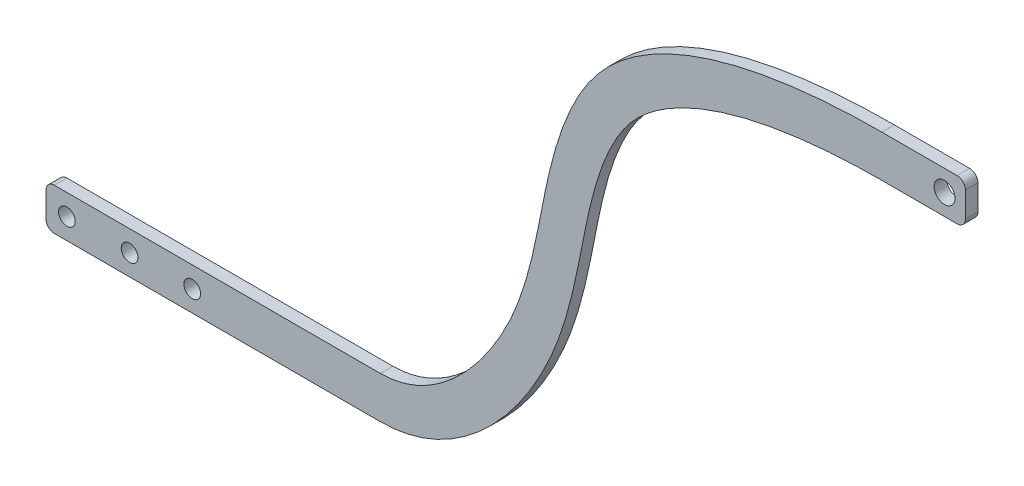
ISO-10303-21;
HEADER;
FILE_DESCRIPTION(('STEP AP214'),'2;1');
FILE_NAME('part.step','',(''),(''),'','','');
FILE_SCHEMA(('AUTOMOTIVE_DESIGN { 1 0 10303 214 1 1 1 1 }'));
ENDSEC;
DATA;
#1=APPLICATION_CONTEXT('core data for automotive mechanical design processes');
#2=APPLICATION_PROTOCOL_DEFINITION('international standard','automotive_design',2000,#1);
#3=PRODUCT_CONTEXT('',#1,'mechanical');
#4=PRODUCT('Part','Part','',(#3));
#5=PRODUCT_RELATED_PRODUCT_CATEGORY('part','',(#4));
#6=PRODUCT_DEFINITION_FORMATION('','',#4);
#7=PRODUCT_DEFINITION_CONTEXT('part definition',#1,'design');
#8=PRODUCT_DEFINITION('design','',#6,#7);
#9=PRODUCT_DEFINITION_SHAPE('','',#8);
#10=(LENGTH_UNIT() NAMED_UNIT(*) SI_UNIT(.MILLI.,.METRE.));
#11=(NAMED_UNIT(*) PLANE_ANGLE_UNIT() SI_UNIT($,.RADIAN.));
#12=(NAMED_UNIT(*) SI_UNIT($,.STERADIAN.) SOLID_ANGLE_UNIT());
#13=UNCERTAINTY_MEASURE_WITH_UNIT(LENGTH_MEASURE(1.E-05),#10,'distance_accuracy_value','');
#14=(GEOMETRIC_REPRESENTATION_CONTEXT(3) GLOBAL_UNCERTAINTY_ASSIGNED_CONTEXT((#13)) GLOBAL_UNIT_ASSIGNED_CONTEXT((#10,
#11,#12)) REPRESENTATION_CONTEXT('',''));
#15=CARTESIAN_POINT('',(0.,0.,0.));
#16=DIRECTION('',(0.,0.,1.));
#17=DIRECTION('',(1.,0.,0.));
#18=AXIS2_PLACEMENT_3D('',#15,#16,#17);
#19=CARTESIAN_POINT('',(0.,0.,3.));
#20=DIRECTION('',(0.,1.,0.));
#21=DIRECTION('',(0.,0.,1.));
#22=AXIS2_PLACEMENT_3D('',#19,#20,#21);
#23=PLANE('',#22);
#24=DIRECTION('',(1.,0.,0.));
#25=VECTOR('',#24,1.);
#26=CARTESIAN_POINT('',(0.,0.,0.));
#27=LINE('',#26,#25);
#28=CARTESIAN_POINT('',(2.,0.,0.));
#29=VERTEX_POINT('',#28);
#30=CARTESIAN_POINT('',(80.,0.,0.));
#31=VERTEX_POINT('',#30);
#32=EDGE_CURVE('E210',#29,#31,#27,.T.);
#33=ORIENTED_EDGE('',*,*,#32,.F.);
#34=DIRECTION('',(0.,0.,-1.));
#35=VECTOR('',#34,1.);
#36=CARTESIAN_POINT('',(2.,0.,3.));
#37=LINE('',#36,#35);
#38=CARTESIAN_POINT('',(2.,0.,3.));
#39=VERTEX_POINT('',#38);
#40=EDGE_CURVE('E11',#29,#39,#37,.F.);
#41=ORIENTED_EDGE('',*,*,#40,.T.);
#42=DIRECTION('',(1.,0.,0.));
#43=VECTOR('',#42,1.);
#44=CARTESIAN_POINT('',(0.,0.,3.));
#45=LINE('',#44,#43);
#46=CARTESIAN_POINT('',(80.,0.,3.));
#47=VERTEX_POINT('',#46);
#48=EDGE_CURVE('E123',#39,#47,#45,.T.);
#49=ORIENTED_EDGE('',*,*,#48,.T.);
#50=DIRECTION('',(0.,0.,-1.));
#51=VECTOR('',#50,1.);
#52=CARTESIAN_POINT('',(80.,0.,3.));
#53=LINE('',#52,#51);
#54=EDGE_CURVE('E126',#47,#31,#53,.T.);
#55=ORIENTED_EDGE('',*,*,#54,.T.);
#56=EDGE_LOOP('',(#33,#41,#49,#55));
#57=FACE_BOUND('',#56,.T.);
#58=ADVANCED_FACE('F33',(#57),#23,.T.);
#59=CARTESIAN_POINT('',(0.,0.,3.));
#60=DIRECTION('',(1.,0.,0.));
#61=DIRECTION('',(0.,0.,-1.));
#62=AXIS2_PLACEMENT_3D('',#59,#60,#61);
#63=PLANE('',#62);
#64=DIRECTION('',(0.,-1.,0.));
#65=VECTOR('',#64,1.);
#66=CARTESIAN_POINT('',(0.,0.,0.));
#67=LINE('',#66,#65);
#68=CARTESIAN_POINT('',(0.,-2.,0.));
#69=VERTEX_POINT('',#68);
#70=CARTESIAN_POINT('',(0.,-8.,0.));
#71=VERTEX_POINT('',#70);
#72=EDGE_CURVE('E132',#69,#71,#67,.T.);
#73=ORIENTED_EDGE('',*,*,#72,.T.);
#74=DIRECTION('',(0.,0.,-1.));
#75=VECTOR('',#74,1.);
#76=CARTESIAN_POINT('',(0.,-8.,3.));
#77=LINE('',#76,#75);
#78=CARTESIAN_POINT('',(0.,-8.,3.));
#79=VERTEX_POINT('',#78);
#80=EDGE_CURVE('E41',#71,#79,#77,.F.);
#81=ORIENTED_EDGE('',*,*,#80,.T.);
#82=DIRECTION('',(0.,-1.,0.));
#83=VECTOR('',#82,1.);
#84=CARTESIAN_POINT('',(0.,0.,3.));
#85=LINE('',#84,#83);
#86=CARTESIAN_POINT('',(0.,-2.,3.));
#87=VERTEX_POINT('',#86);
#88=EDGE_CURVE('E140',#87,#79,#85,.T.);
#89=ORIENTED_EDGE('',*,*,#88,.F.);
#90=DIRECTION('',(0.,0.,-1.));
#91=VECTOR('',#90,1.);
#92=CARTESIAN_POINT('',(0.,-2.,0.));
#93=LINE('',#92,#91);
#94=EDGE_CURVE('E197',#87,#69,#93,.T.);
#95=ORIENTED_EDGE('',*,*,#94,.T.);
#96=EDGE_LOOP('',(#73,#81,#89,#95));
#97=FACE_BOUND('',#96,.T.);
#98=ADVANCED_FACE('F164',(#97),#63,.F.);
#99=CARTESIAN_POINT('',(0.,-10.,3.));
#100=DIRECTION('',(0.,1.,0.));
#101=DIRECTION('',(0.,0.,1.));
#102=AXIS2_PLACEMENT_3D('',#99,#100,#101);
#103=PLANE('',#102);
#104=DIRECTION('',(1.,0.,0.));
#105=VECTOR('',#104,1.);
#106=CARTESIAN_POINT('',(0.,-10.,3.));
#107=LINE('',#106,#105);
#108=CARTESIAN_POINT('',(2.,-10.,3.));
#109=VERTEX_POINT('',#108);
#110=CARTESIAN_POINT('',(80.,-10.,3.));
#111=VERTEX_POINT('',#110);
#112=EDGE_CURVE('E204',#109,#111,#107,.T.);
#113=ORIENTED_EDGE('',*,*,#112,.F.);
#114=DIRECTION('',(0.,0.,-1.));
#115=VECTOR('',#114,1.);
#116=CARTESIAN_POINT('',(2.,-10.,3.));
#117=LINE('',#116,#115);
#118=CARTESIAN_POINT('',(2.,-10.,0.));
#119=VERTEX_POINT('',#118);
#120=EDGE_CURVE('E183',#109,#119,#117,.T.);
#121=ORIENTED_EDGE('',*,*,#120,.T.);
#122=DIRECTION('',(1.,0.,0.));
#123=VECTOR('',#122,1.);
#124=CARTESIAN_POINT('',(0.,-10.,0.));
#125=LINE('',#124,#123);
#126=CARTESIAN_POINT('',(80.,-10.,0.));
#127=VERTEX_POINT('',#126);
#128=EDGE_CURVE('E232',#119,#127,#125,.T.);
#129=ORIENTED_EDGE('',*,*,#128,.T.);
#130=DIRECTION('',(0.,0.,-1.));
#131=VECTOR('',#130,1.);
#132=CARTESIAN_POINT('',(80.,-10.,3.));
#133=LINE('',#132,#131);
#134=EDGE_CURVE('E238',#111,#127,#133,.T.);
#135=ORIENTED_EDGE('',*,*,#134,.F.);
#136=EDGE_LOOP('',(#113,#121,#129,#135));
#137=FACE_BOUND('',#136,.T.);
#138=ADVANCED_FACE('F281',(#137),#103,.F.);
#139=CARTESIAN_POINT('',(80.,-10.,3.));
#140=CARTESIAN_POINT('',(81.3384506040119,-10.,3.));
#141=CARTESIAN_POINT('',(84.0402998994058,-9.81402230120691,3.));
#142=CARTESIAN_POINT('',(89.1719488282902,-8.77343168864095,3.));
#143=CARTESIAN_POINT('',(95.096140774382,-6.39796257086661,3.));
#144=CARTESIAN_POINT('',(101.320848398126,-2.35107771660496,3.));
#145=CARTESIAN_POINT('',(108.584153803988,4.16806824020185,3.));
#146=CARTESIAN_POINT('',(115.951573110774,13.7932092781709,3.));
#147=CARTESIAN_POINT('',(122.226980389347,26.3530694563131,3.));
#148=CARTESIAN_POINT('',(125.834100638527,38.4078407445756,3.));
#149=CARTESIAN_POINT('',(128.086880280471,49.6348944836228,3.));
#150=CARTESIAN_POINT('',(129.760964156866,58.2391235896634,3.));
#151=CARTESIAN_POINT('',(131.439150702586,64.7119328289792,3.));
#152=CARTESIAN_POINT('',(133.475999532295,70.9877959664929,3.));
#153=CARTESIAN_POINT('',(136.119804101757,76.7090649971012,3.));
#154=CARTESIAN_POINT('',(139.295139146374,81.312488332186,3.));
#155=CARTESIAN_POINT('',(142.969844702231,85.3104541794592,3.));
#156=CARTESIAN_POINT('',(148.880794013187,89.7052846615208,3.));
#157=CARTESIAN_POINT('',(157.775180444439,93.8597378820239,3.));
#158=CARTESIAN_POINT('',(167.976748847415,96.8773770187565,3.));
#159=CARTESIAN_POINT('',(177.046331544471,98.4927274466315,3.));
#160=CARTESIAN_POINT('',(184.331013440901,99.319764785158,3.));
#161=CARTESIAN_POINT('',(189.734131763018,99.7304442522045,3.));
#162=CARTESIAN_POINT('',(194.116725780543,99.9183122908205,3.));
#163=CARTESIAN_POINT('',(197.527693678118,99.9889766035525,3.));
#164=CARTESIAN_POINT('',(199.170669273605,100.,3.));
#165=CARTESIAN_POINT('',(200.,100.,3.));
#166=B_SPLINE_CURVE_WITH_KNOTS('',3,(#139,#140,#141,#142,#143,#144,#145,#146,#147,#148,#149,
#150,#151,#152,#153,#154,#155,#156,#157,#158,#159,#160,#161,#162,#163,#164,#165),.UNSPECIFIED.,
.F.,.F.,(4,1,1,1,1,1,1,1,1,1,1,1,1,1,1,1,1,1,1,1,1,1,1,1,4),(0.,0.015625,0.03125,0.0625,0.09375,
0.125,0.1875,0.25,0.3125,0.375,0.4375,0.46875,0.5,0.5625,0.59375,0.625,0.6875,0.75,0.8125,0.875,
0.90625,0.9375,0.96875,0.984375,1.),.UNSPECIFIED.);
#167=DIRECTION('',(0.,0.,-1.));
#168=VECTOR('',#167,1.);
#169=SURFACE_OF_LINEAR_EXTRUSION('',#166,#168);
#170=CARTESIAN_POINT('',(80.,-10.,0.));
#171=CARTESIAN_POINT('',(81.3384506040119,-10.,0.));
#172=CARTESIAN_POINT('',(84.0402998994058,-9.81402230120691,0.));
#173=CARTESIAN_POINT('',(89.1719488282902,-8.77343168864095,0.));
#174=CARTESIAN_POINT('',(95.096140774382,-6.39796257086661,0.));
#175=CARTESIAN_POINT('',(101.320848398126,-2.35107771660496,0.));
#176=CARTESIAN_POINT('',(108.584153803988,4.16806824020185,0.));
#177=CARTESIAN_POINT('',(115.951573110774,13.7932092781709,0.));
#178=CARTESIAN_POINT('',(122.226980389347,26.3530694563131,0.));
#179=CARTESIAN_POINT('',(125.834100638527,38.4078407445756,0.));
#180=CARTESIAN_POINT('',(128.086880280471,49.6348944836228,0.));
#181=CARTESIAN_POINT('',(129.760964156866,58.2391235896634,0.));
#182=CARTESIAN_POINT('',(131.439150702586,64.7119328289792,0.));
#183=CARTESIAN_POINT('',(133.475999532295,70.9877959664929,0.));
#184=CARTESIAN_POINT('',(136.119804101757,76.7090649971012,0.));
#185=CARTESIAN_POINT('',(139.295139146374,81.312488332186,0.));
#186=CARTESIAN_POINT('',(142.969844702231,85.3104541794592,0.));
#187=CARTESIAN_POINT('',(148.880794013187,89.7052846615208,0.));
#188=CARTESIAN_POINT('',(157.775180444439,93.8597378820239,0.));
#189=CARTESIAN_POINT('',(167.976748847415,96.8773770187565,0.));
#190=CARTESIAN_POINT('',(177.046331544471,98.4927274466315,0.));
#191=CARTESIAN_POINT('',(184.331013440901,99.319764785158,0.));
#192=CARTESIAN_POINT('',(189.734131763018,99.7304442522045,0.));
#193=CARTESIAN_POINT('',(194.116725780543,99.9183122908205,0.));
#194=CARTESIAN_POINT('',(197.527693678118,99.9889766035525,0.));
#195=CARTESIAN_POINT('',(199.170669273605,100.,0.));
#196=CARTESIAN_POINT('',(200.,100.,0.));
#197=B_SPLINE_CURVE_WITH_KNOTS('',3,(#170,#171,#172,#173,#174,#175,#176,#177,#178,#179,#180,
#181,#182,#183,#184,#185,#186,#187,#188,#189,#190,#191,#192,#193,#194,#195,#196),.UNSPECIFIED.,
.F.,.F.,(4,1,1,1,1,1,1,1,1,1,1,1,1,1,1,1,1,1,1,1,1,1,1,1,4),(0.,0.015625,0.03125,0.0625,0.09375,
0.125,0.1875,0.25,0.3125,0.375,0.4375,0.46875,0.5,0.5625,0.59375,0.625,0.6875,0.75,0.8125,0.875,
0.90625,0.9375,0.96875,0.984375,1.),.UNSPECIFIED.);
#198=CARTESIAN_POINT('',(200.,100.,0.));
#199=VERTEX_POINT('',#198);
#200=EDGE_CURVE('E228',#127,#199,#197,.T.);
#201=ORIENTED_EDGE('',*,*,#200,.T.);
#202=DIRECTION('',(0.,0.,-1.));
#203=VECTOR('',#202,1.);
#204=CARTESIAN_POINT('',(200.,100.,3.));
#205=LINE('',#204,#203);
#206=CARTESIAN_POINT('',(200.,100.,3.));
#207=VERTEX_POINT('',#206);
#208=EDGE_CURVE('E242',#207,#199,#205,.T.);
#209=ORIENTED_EDGE('',*,*,#208,.F.);
#210=EDGE_CURVE('E206',#111,#207,#166,.T.);
#211=ORIENTED_EDGE('',*,*,#210,.F.);
#212=ORIENTED_EDGE('',*,*,#134,.T.);
#213=EDGE_LOOP('',(#201,#209,#211,#212));
#214=FACE_BOUND('',#213,.T.);
#215=ADVANCED_FACE('F284',(#214),#169,.F.);
#216=CARTESIAN_POINT('',(200.,100.,3.));
#217=DIRECTION('',(0.,1.,0.));
#218=DIRECTION('',(0.,0.,1.));
#219=AXIS2_PLACEMENT_3D('',#216,#217,#218);
#220=PLANE('',#219);
#221=DIRECTION('',(1.,0.,0.));
#222=VECTOR('',#221,1.);
#223=CARTESIAN_POINT('',(200.,100.,0.));
#224=LINE('',#223,#222);
#225=CARTESIAN_POINT('',(218.,100.,0.));
#226=VERTEX_POINT('',#225);
#227=EDGE_CURVE('E225',#199,#226,#224,.T.);
#228=ORIENTED_EDGE('',*,*,#227,.T.);
#229=DIRECTION('',(0.,0.,-1.));
#230=VECTOR('',#229,1.);
#231=CARTESIAN_POINT('',(218.,100.,3.));
#232=LINE('',#231,#230);
#233=CARTESIAN_POINT('',(218.,100.,3.));
#234=VERTEX_POINT('',#233);
#235=EDGE_CURVE('E188',#226,#234,#232,.F.);
#236=ORIENTED_EDGE('',*,*,#235,.T.);
#237=DIRECTION('',(1.,0.,0.));
#238=VECTOR('',#237,1.);
#239=CARTESIAN_POINT('',(200.,100.,3.));
#240=LINE('',#239,#238);
#241=EDGE_CURVE('E261',#207,#234,#240,.T.);
#242=ORIENTED_EDGE('',*,*,#241,.F.);
#243=ORIENTED_EDGE('',*,*,#208,.T.);
#244=EDGE_LOOP('',(#228,#236,#242,#243));
#245=FACE_BOUND('',#244,.T.);
#246=ADVANCED_FACE('F260',(#245),#220,.F.);
#247=CARTESIAN_POINT('',(220.,110.,3.));
#248=DIRECTION('',(1.,0.,0.));
#249=DIRECTION('',(0.,0.,-1.));
#250=AXIS2_PLACEMENT_3D('',#247,#248,#249);
#251=PLANE('',#250);
#252=DIRECTION('',(0.,-1.,0.));
#253=VECTOR('',#252,1.);
#254=CARTESIAN_POINT('',(220.,110.,3.));
#255=LINE('',#254,#253);
#256=CARTESIAN_POINT('',(220.,108.,3.));
#257=VERTEX_POINT('',#256);
#258=CARTESIAN_POINT('',(220.,102.,3.));
#259=VERTEX_POINT('',#258);
#260=EDGE_CURVE('E146',#257,#259,#255,.T.);
#261=ORIENTED_EDGE('',*,*,#260,.T.);
#262=DIRECTION('',(0.,0.,-1.));
#263=VECTOR('',#262,1.);
#264=CARTESIAN_POINT('',(220.,102.,0.));
#265=LINE('',#264,#263);
#266=CARTESIAN_POINT('',(220.,102.,0.));
#267=VERTEX_POINT('',#266);
#268=EDGE_CURVE('E247',#259,#267,#265,.T.);
#269=ORIENTED_EDGE('',*,*,#268,.T.);
#270=DIRECTION('',(0.,-1.,0.));
#271=VECTOR('',#270,1.);
#272=CARTESIAN_POINT('',(220.,110.,0.));
#273=LINE('',#272,#271);
#274=CARTESIAN_POINT('',(220.,108.,0.));
#275=VERTEX_POINT('',#274);
#276=EDGE_CURVE('E222',#275,#267,#273,.T.);
#277=ORIENTED_EDGE('',*,*,#276,.F.);
#278=DIRECTION('',(0.,0.,-1.));
#279=VECTOR('',#278,1.);
#280=CARTESIAN_POINT('',(220.,108.,3.));
#281=LINE('',#280,#279);
#282=EDGE_CURVE('E241',#275,#257,#281,.F.);
#283=ORIENTED_EDGE('',*,*,#282,.T.);
#284=EDGE_LOOP('',(#261,#269,#277,#283));
#285=FACE_BOUND('',#284,.T.);
#286=ADVANCED_FACE('F271',(#285),#251,.T.);
#287=CARTESIAN_POINT('',(200.,110.,3.));
#288=DIRECTION('',(0.,1.,0.));
#289=DIRECTION('',(-1.,0.,0.));
#290=AXIS2_PLACEMENT_3D('',#287,#288,#289);
#291=PLANE('',#290);
#292=DIRECTION('',(1.,0.,0.));
#293=VECTOR('',#292,1.);
#294=CARTESIAN_POINT('',(200.,110.,3.));
#295=LINE('',#294,#293);
#296=CARTESIAN_POINT('',(200.,110.,3.));
#297=VERTEX_POINT('',#296);
#298=CARTESIAN_POINT('',(218.,110.,3.));
#299=VERTEX_POINT('',#298);
#300=EDGE_CURVE('E144',#297,#299,#295,.T.);
#301=ORIENTED_EDGE('',*,*,#300,.T.);
#302=DIRECTION('',(0.,0.,-1.));
#303=VECTOR('',#302,1.);
#304=CARTESIAN_POINT('',(218.,110.,3.));
#305=LINE('',#304,#303);
#306=CARTESIAN_POINT('',(218.,110.,0.));
#307=VERTEX_POINT('',#306);
#308=EDGE_CURVE('E193',#299,#307,#305,.T.);
#309=ORIENTED_EDGE('',*,*,#308,.T.);
#310=DIRECTION('',(1.,0.,0.));
#311=VECTOR('',#310,1.);
#312=CARTESIAN_POINT('',(200.,110.,0.));
#313=LINE('',#312,#311);
#314=CARTESIAN_POINT('',(200.,110.,0.));
#315=VERTEX_POINT('',#314);
#316=EDGE_CURVE('E216',#315,#307,#313,.T.);
#317=ORIENTED_EDGE('',*,*,#316,.F.);
#318=DIRECTION('',(0.,0.,-1.));
#319=VECTOR('',#318,1.);
#320=CARTESIAN_POINT('',(200.,110.,3.));
#321=LINE('',#320,#319);
#322=EDGE_CURVE('E139',#297,#315,#321,.T.);
#323=ORIENTED_EDGE('',*,*,#322,.F.);
#324=EDGE_LOOP('',(#301,#309,#317,#323));
#325=FACE_BOUND('',#324,.T.);
#326=ADVANCED_FACE('F160',(#325),#291,.T.);
#327=CARTESIAN_POINT('',(80.,0.,3.));
#328=CARTESIAN_POINT('',(93.241777408656,0.,3.));
#329=CARTESIAN_POINT('',(116.662532156459,26.8843788712468,3.));
#330=CARTESIAN_POINT('',(118.223670955504,60.6841961486001,3.));
#331=CARTESIAN_POINT('',(136.379625173297,104.815244744368,3.));
#332=CARTESIAN_POINT('',(177.58188535664,110.,3.));
#333=CARTESIAN_POINT('',(200.,110.,3.));
#334=B_SPLINE_CURVE_WITH_KNOTS('',3,(#327,#328,#329,#330,#331,#332,#333),.UNSPECIFIED.,.F.,.F.,
(4,1,1,1,4),(0.,0.230202035400409,0.463699786897665,0.593998921391816,1.),.UNSPECIFIED.);
#335=DIRECTION('',(0.,0.,-1.));
#336=VECTOR('',#335,1.);
#337=SURFACE_OF_LINEAR_EXTRUSION('',#334,#336);
#338=CARTESIAN_POINT('',(80.,0.,0.));
#339=CARTESIAN_POINT('',(93.241777408656,0.,0.));
#340=CARTESIAN_POINT('',(116.662532156459,26.8843788712468,0.));
#341=CARTESIAN_POINT('',(118.223670955504,60.6841961486001,0.));
#342=CARTESIAN_POINT('',(136.379625173297,104.815244744368,0.));
#343=CARTESIAN_POINT('',(177.58188535664,110.,0.));
#344=CARTESIAN_POINT('',(200.,110.,0.));
#345=B_SPLINE_CURVE_WITH_KNOTS('',3,(#338,#339,#340,#341,#342,#343,#344),.UNSPECIFIED.,.F.,.F.,
(4,1,1,1,4),(0.,0.230202035400409,0.463699786897665,0.593998921391816,1.),.UNSPECIFIED.);
#346=EDGE_CURVE('E138',#31,#315,#345,.T.);
#347=ORIENTED_EDGE('',*,*,#346,.F.);
#348=ORIENTED_EDGE('',*,*,#54,.F.);
#349=EDGE_CURVE('E131',#47,#297,#334,.T.);
#350=ORIENTED_EDGE('',*,*,#349,.T.);
#351=ORIENTED_EDGE('',*,*,#322,.T.);
#352=EDGE_LOOP('',(#347,#348,#350,#351));
#353=FACE_BOUND('',#352,.T.);
#354=ADVANCED_FACE('F136',(#353),#337,.T.);
#355=CARTESIAN_POINT('',(123.629748569451,72.8182809620855,3.));
#356=DIRECTION('',(0.,0.,-1.));
#357=DIRECTION('',(-1.,0.,0.));
#358=AXIS2_PLACEMENT_3D('',#355,#356,#357);
#359=PLANE('',#358);
#360=CARTESIAN_POINT('',(20.,-5.,3.));
#361=DIRECTION('',(0.,0.,1.));
#362=DIRECTION('',(1.,0.,0.));
#363=AXIS2_PLACEMENT_3D('',#360,#361,#362);
#364=CIRCLE('',#363,2.);
#365=CARTESIAN_POINT('',(22.,-5.,3.));
#366=VERTEX_POINT('',#365);
#367=EDGE_CURVE('E431',#366,#366,#364,.T.);
#368=ORIENTED_EDGE('',*,*,#367,.F.);
#369=EDGE_LOOP('',(#368));
#370=FACE_BOUND('',#369,.T.);
#371=CARTESIAN_POINT('',(35.,-5.,3.));
#372=DIRECTION('',(0.,0.,1.));
#373=DIRECTION('',(1.,0.,0.));
#374=AXIS2_PLACEMENT_3D('',#371,#372,#373);
#375=CIRCLE('',#374,2.);
#376=CARTESIAN_POINT('',(37.,-5.,3.));
#377=VERTEX_POINT('',#376);
#378=EDGE_CURVE('E443',#377,#377,#375,.T.);
#379=ORIENTED_EDGE('',*,*,#378,.F.);
#380=EDGE_LOOP('',(#379));
#381=FACE_BOUND('',#380,.T.);
#382=CARTESIAN_POINT('',(5.,-5.,3.));
#383=DIRECTION('',(0.,0.,1.));
#384=DIRECTION('',(1.,0.,0.));
#385=AXIS2_PLACEMENT_3D('',#382,#383,#384);
#386=CIRCLE('',#385,2.);
#387=CARTESIAN_POINT('',(7.,-5.,3.));
#388=VERTEX_POINT('',#387);
#389=EDGE_CURVE('E435',#388,#388,#386,.T.);
#390=ORIENTED_EDGE('',*,*,#389,.F.);
#391=EDGE_LOOP('',(#390));
#392=FACE_BOUND('',#391,.T.);
#393=CARTESIAN_POINT('',(215.,105.,3.));
#394=DIRECTION('',(0.,0.,1.));
#395=DIRECTION('',(1.,0.,0.));
#396=AXIS2_PLACEMENT_3D('',#393,#394,#395);
#397=CIRCLE('',#396,2.5);
#398=CARTESIAN_POINT('',(217.5,105.,3.));
#399=VERTEX_POINT('',#398);
#400=EDGE_CURVE('E450',#399,#399,#397,.T.);
#401=ORIENTED_EDGE('',*,*,#400,.F.);
#402=EDGE_LOOP('',(#401));
#403=FACE_BOUND('',#402,.T.);
#404=ORIENTED_EDGE('',*,*,#241,.T.);
#405=CARTESIAN_POINT('',(218.,102.,3.));
#406=DIRECTION('',(0.,0.,-1.));
#407=DIRECTION('',(-1.,0.,0.));
#408=AXIS2_PLACEMENT_3D('',#405,#406,#407);
#409=CIRCLE('',#408,2.);
#410=EDGE_CURVE('E186',#234,#259,#409,.F.);
#411=ORIENTED_EDGE('',*,*,#410,.T.);
#412=ORIENTED_EDGE('',*,*,#260,.F.);
#413=CARTESIAN_POINT('',(218.,108.,3.));
#414=DIRECTION('',(0.,0.,-1.));
#415=DIRECTION('',(-1.,0.,0.));
#416=AXIS2_PLACEMENT_3D('',#413,#414,#415);
#417=CIRCLE('',#416,2.);
#418=EDGE_CURVE('E48',#257,#299,#417,.F.);
#419=ORIENTED_EDGE('',*,*,#418,.T.);
#420=ORIENTED_EDGE('',*,*,#300,.F.);
#421=ORIENTED_EDGE('',*,*,#349,.F.);
#422=ORIENTED_EDGE('',*,*,#48,.F.);
#423=CARTESIAN_POINT('',(2.,-2.,3.));
#424=DIRECTION('',(0.,0.,-1.));
#425=DIRECTION('',(-1.,0.,0.));
#426=AXIS2_PLACEMENT_3D('',#423,#424,#425);
#427=CIRCLE('',#426,2.);
#428=EDGE_CURVE('E184',#39,#87,#427,.F.);
#429=ORIENTED_EDGE('',*,*,#428,.T.);
#430=ORIENTED_EDGE('',*,*,#88,.T.);
#431=CARTESIAN_POINT('',(2.,-8.,3.));
#432=DIRECTION('',(0.,0.,-1.));
#433=DIRECTION('',(-1.,0.,0.));
#434=AXIS2_PLACEMENT_3D('',#431,#432,#433);
#435=CIRCLE('',#434,2.);
#436=EDGE_CURVE('E55',#79,#109,#435,.F.);
#437=ORIENTED_EDGE('',*,*,#436,.T.);
#438=ORIENTED_EDGE('',*,*,#112,.T.);
#439=ORIENTED_EDGE('',*,*,#210,.T.);
#440=EDGE_LOOP('',(#404,#411,#412,#419,#420,#421,#422,#429,#430,#437,#438,#439));
#441=FACE_BOUND('',#440,.T.);
#442=ADVANCED_FACE('F143',(#370,#381,#392,#403,#441),#359,.F.);
#443=CARTESIAN_POINT('',(123.629748569451,72.8182809620855,0.));
#444=DIRECTION('',(0.,0.,-1.));
#445=DIRECTION('',(-1.,0.,0.));
#446=AXIS2_PLACEMENT_3D('',#443,#444,#445);
#447=PLANE('',#446);
#448=CARTESIAN_POINT('',(20.,-5.,0.));
#449=DIRECTION('',(0.,0.,-1.));
#450=DIRECTION('',(-1.,0.,0.));
#451=AXIS2_PLACEMENT_3D('',#448,#449,#450);
#452=CIRCLE('',#451,2.);
#453=CARTESIAN_POINT('',(18.,-5.,0.));
#454=VERTEX_POINT('',#453);
#455=EDGE_CURVE('E434',#454,#454,#452,.F.);
#456=ORIENTED_EDGE('',*,*,#455,.T.);
#457=EDGE_LOOP('',(#456));
#458=FACE_BOUND('',#457,.T.);
#459=CARTESIAN_POINT('',(35.,-5.,0.));
#460=DIRECTION('',(0.,0.,-1.));
#461=DIRECTION('',(-1.,0.,0.));
#462=AXIS2_PLACEMENT_3D('',#459,#460,#461);
#463=CIRCLE('',#462,2.);
#464=CARTESIAN_POINT('',(33.,-5.,0.));
#465=VERTEX_POINT('',#464);
#466=EDGE_CURVE('E440',#465,#465,#463,.F.);
#467=ORIENTED_EDGE('',*,*,#466,.T.);
#468=EDGE_LOOP('',(#467));
#469=FACE_BOUND('',#468,.T.);
#470=CARTESIAN_POINT('',(5.,-5.,0.));
#471=DIRECTION('',(0.,0.,-1.));
#472=DIRECTION('',(-1.,0.,0.));
#473=AXIS2_PLACEMENT_3D('',#470,#471,#472);
#474=CIRCLE('',#473,2.);
#475=CARTESIAN_POINT('',(3.,-5.,0.));
#476=VERTEX_POINT('',#475);
#477=EDGE_CURVE('E438',#476,#476,#474,.F.);
#478=ORIENTED_EDGE('',*,*,#477,.T.);
#479=EDGE_LOOP('',(#478));
#480=FACE_BOUND('',#479,.T.);
#481=CARTESIAN_POINT('',(215.,105.,0.));
#482=DIRECTION('',(0.,0.,-1.));
#483=DIRECTION('',(-1.,0.,0.));
#484=AXIS2_PLACEMENT_3D('',#481,#482,#483);
#485=CIRCLE('',#484,2.5);
#486=CARTESIAN_POINT('',(212.5,105.,0.));
#487=VERTEX_POINT('',#486);
#488=EDGE_CURVE('E212',#487,#487,#485,.F.);
#489=ORIENTED_EDGE('',*,*,#488,.T.);
#490=EDGE_LOOP('',(#489));
#491=FACE_BOUND('',#490,.T.);
#492=ORIENTED_EDGE('',*,*,#276,.T.);
#493=CARTESIAN_POINT('',(218.,102.,0.));
#494=DIRECTION('',(0.,0.,-1.));
#495=DIRECTION('',(-1.,0.,0.));
#496=AXIS2_PLACEMENT_3D('',#493,#494,#495);
#497=CIRCLE('',#496,2.);
#498=EDGE_CURVE('E256',#267,#226,#497,.T.);
#499=ORIENTED_EDGE('',*,*,#498,.T.);
#500=ORIENTED_EDGE('',*,*,#227,.F.);
#501=ORIENTED_EDGE('',*,*,#200,.F.);
#502=ORIENTED_EDGE('',*,*,#128,.F.);
#503=CARTESIAN_POINT('',(2.,-8.,0.));
#504=DIRECTION('',(0.,0.,-1.));
#505=DIRECTION('',(-1.,0.,0.));
#506=AXIS2_PLACEMENT_3D('',#503,#504,#505);
#507=CIRCLE('',#506,2.);
#508=EDGE_CURVE('E252',#119,#71,#507,.T.);
#509=ORIENTED_EDGE('',*,*,#508,.T.);
#510=ORIENTED_EDGE('',*,*,#72,.F.);
#511=CARTESIAN_POINT('',(2.,-2.,0.));
#512=DIRECTION('',(0.,0.,-1.));
#513=DIRECTION('',(-1.,0.,0.));
#514=AXIS2_PLACEMENT_3D('',#511,#512,#513);
#515=CIRCLE('',#514,2.);
#516=EDGE_CURVE('E250',#69,#29,#515,.T.);
#517=ORIENTED_EDGE('',*,*,#516,.T.);
#518=ORIENTED_EDGE('',*,*,#32,.T.);
#519=ORIENTED_EDGE('',*,*,#346,.T.);
#520=ORIENTED_EDGE('',*,*,#316,.T.);
#521=CARTESIAN_POINT('',(218.,108.,0.));
#522=DIRECTION('',(0.,0.,-1.));
#523=DIRECTION('',(-1.,0.,0.));
#524=AXIS2_PLACEMENT_3D('',#521,#522,#523);
#525=CIRCLE('',#524,2.);
#526=EDGE_CURVE('E254',#307,#275,#525,.T.);
#527=ORIENTED_EDGE('',*,*,#526,.T.);
#528=EDGE_LOOP('',(#492,#499,#500,#501,#502,#509,#510,#517,#518,#519,#520,#527));
#529=FACE_BOUND('',#528,.T.);
#530=ADVANCED_FACE('F274',(#458,#469,#480,#491,#529),#447,.T.);
#531=CARTESIAN_POINT('',(215.,105.,-7.07106781186548));
#532=DIRECTION('',(0.,0.,1.));
#533=DIRECTION('',(1.,0.,0.));
#534=AXIS2_PLACEMENT_3D('',#531,#532,#533);
#535=CYLINDRICAL_SURFACE('',#534,2.5);
#536=ORIENTED_EDGE('',*,*,#400,.T.);
#537=EDGE_LOOP('',(#536));
#538=FACE_BOUND('',#537,.T.);
#539=ORIENTED_EDGE('',*,*,#488,.F.);
#540=EDGE_LOOP('',(#539));
#541=FACE_BOUND('',#540,.T.);
#542=ADVANCED_FACE('F322',(#538,#541),#535,.F.);
#543=CARTESIAN_POINT('',(5.,-5.,-5.65685424949239));
#544=DIRECTION('',(0.,0.,1.));
#545=DIRECTION('',(1.,0.,0.));
#546=AXIS2_PLACEMENT_3D('',#543,#544,#545);
#547=CYLINDRICAL_SURFACE('',#546,2.);
#548=ORIENTED_EDGE('',*,*,#389,.T.);
#549=EDGE_LOOP('',(#548));
#550=FACE_BOUND('',#549,.T.);
#551=ORIENTED_EDGE('',*,*,#477,.F.);
#552=EDGE_LOOP('',(#551));
#553=FACE_BOUND('',#552,.T.);
#554=ADVANCED_FACE('F330',(#550,#553),#547,.F.);
#555=CARTESIAN_POINT('',(35.,-5.,-5.65685424949239));
#556=DIRECTION('',(0.,0.,1.));
#557=DIRECTION('',(1.,0.,0.));
#558=AXIS2_PLACEMENT_3D('',#555,#556,#557);
#559=CYLINDRICAL_SURFACE('',#558,2.);
#560=ORIENTED_EDGE('',*,*,#378,.T.);
#561=EDGE_LOOP('',(#560));
#562=FACE_BOUND('',#561,.T.);
#563=ORIENTED_EDGE('',*,*,#466,.F.);
#564=EDGE_LOOP('',(#563));
#565=FACE_BOUND('',#564,.T.);
#566=ADVANCED_FACE('F338',(#562,#565),#559,.F.);
#567=CARTESIAN_POINT('',(20.,-5.,-5.65685424949239));
#568=DIRECTION('',(0.,0.,1.));
#569=DIRECTION('',(1.,0.,0.));
#570=AXIS2_PLACEMENT_3D('',#567,#568,#569);
#571=CYLINDRICAL_SURFACE('',#570,2.);
#572=ORIENTED_EDGE('',*,*,#367,.T.);
#573=EDGE_LOOP('',(#572));
#574=FACE_BOUND('',#573,.T.);
#575=ORIENTED_EDGE('',*,*,#455,.F.);
#576=EDGE_LOOP('',(#575));
#577=FACE_BOUND('',#576,.T.);
#578=ADVANCED_FACE('F169',(#574,#577),#571,.F.);
#579=CARTESIAN_POINT('',(218.,102.,3.));
#580=DIRECTION('',(0.,0.,1.));
#581=DIRECTION('',(1.,0.,0.));
#582=AXIS2_PLACEMENT_3D('',#579,#580,#581);
#583=CYLINDRICAL_SURFACE('',#582,2.);
#584=ORIENTED_EDGE('',*,*,#410,.F.);
#585=ORIENTED_EDGE('',*,*,#235,.F.);
#586=ORIENTED_EDGE('',*,*,#498,.F.);
#587=ORIENTED_EDGE('',*,*,#268,.F.);
#588=EDGE_LOOP('',(#584,#585,#586,#587));
#589=FACE_BOUND('',#588,.T.);
#590=ADVANCED_FACE('F165',(#589),#583,.T.);
#591=CARTESIAN_POINT('',(218.,108.,3.));
#592=DIRECTION('',(0.,0.,-1.));
#593=DIRECTION('',(-1.,0.,0.));
#594=AXIS2_PLACEMENT_3D('',#591,#592,#593);
#595=CYLINDRICAL_SURFACE('',#594,2.);
#596=ORIENTED_EDGE('',*,*,#418,.F.);
#597=ORIENTED_EDGE('',*,*,#282,.F.);
#598=ORIENTED_EDGE('',*,*,#526,.F.);
#599=ORIENTED_EDGE('',*,*,#308,.F.);
#600=EDGE_LOOP('',(#596,#597,#598,#599));
#601=FACE_BOUND('',#600,.T.);
#602=ADVANCED_FACE('F168',(#601),#595,.T.);
#603=CARTESIAN_POINT('',(2.,-8.,3.));
#604=DIRECTION('',(0.,0.,-1.));
#605=DIRECTION('',(-1.,0.,0.));
#606=AXIS2_PLACEMENT_3D('',#603,#604,#605);
#607=CYLINDRICAL_SURFACE('',#606,2.);
#608=ORIENTED_EDGE('',*,*,#436,.F.);
#609=ORIENTED_EDGE('',*,*,#80,.F.);
#610=ORIENTED_EDGE('',*,*,#508,.F.);
#611=ORIENTED_EDGE('',*,*,#120,.F.);
#612=EDGE_LOOP('',(#608,#609,#610,#611));
#613=FACE_BOUND('',#612,.T.);
#614=ADVANCED_FACE('F172',(#613),#607,.T.);
#615=CARTESIAN_POINT('',(2.,-2.,3.));
#616=DIRECTION('',(0.,0.,1.));
#617=DIRECTION('',(1.,0.,0.));
#618=AXIS2_PLACEMENT_3D('',#615,#616,#617);
#619=CYLINDRICAL_SURFACE('',#618,2.);
#620=ORIENTED_EDGE('',*,*,#428,.F.);
#621=ORIENTED_EDGE('',*,*,#40,.F.);
#622=ORIENTED_EDGE('',*,*,#516,.F.);
#623=ORIENTED_EDGE('',*,*,#94,.F.);
#624=EDGE_LOOP('',(#620,#621,#622,#623));
#625=FACE_BOUND('',#624,.T.);
#626=ADVANCED_FACE('F35',(#625),#619,.T.);
#627=CLOSED_SHELL('',(#58,#98,#138,#215,#246,#286,#326,#354,#442,#530,#542,#554,#566,#578,#590,
#602,#614,#626));
#628=MANIFOLD_SOLID_BREP('B2',#627);
#629=ADVANCED_BREP_SHAPE_REPRESENTATION('',(#18,#628),#14);
#630=SHAPE_DEFINITION_REPRESENTATION(#9,#629);
ENDSEC;
END-ISO-10303-21;
